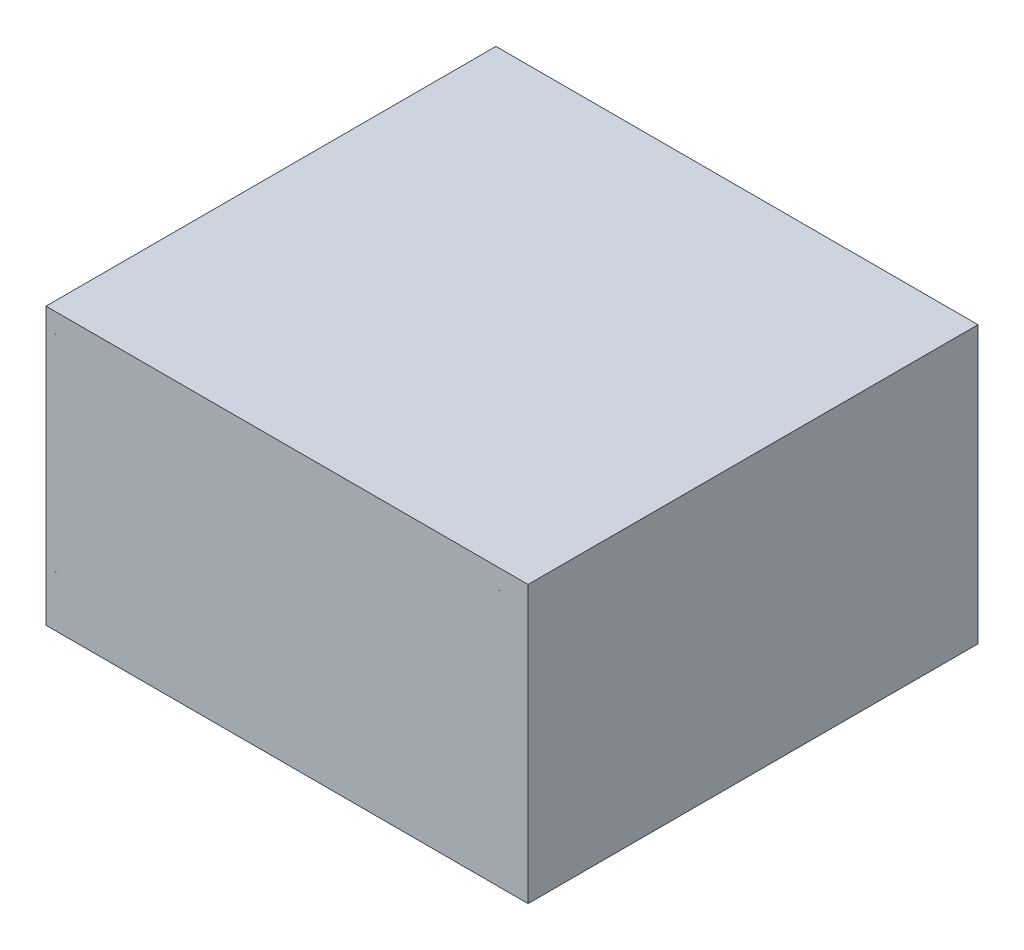
ISO-10303-21;
HEADER;
FILE_DESCRIPTION(('STEP AP214'),'2;1');
FILE_NAME('part.step','',(''),(''),'','','');
FILE_SCHEMA(('AUTOMOTIVE_DESIGN { 1 0 10303 214 1 1 1 1 }'));
ENDSEC;
DATA;
#1=APPLICATION_CONTEXT('core data for automotive mechanical design processes');
#2=APPLICATION_PROTOCOL_DEFINITION('international standard','automotive_design',2000,#1);
#3=PRODUCT_CONTEXT('',#1,'mechanical');
#4=PRODUCT('Part','Part','',(#3));
#5=PRODUCT_RELATED_PRODUCT_CATEGORY('part','',(#4));
#6=PRODUCT_DEFINITION_FORMATION('','',#4);
#7=PRODUCT_DEFINITION_CONTEXT('part definition',#1,'design');
#8=PRODUCT_DEFINITION('design','',#6,#7);
#9=PRODUCT_DEFINITION_SHAPE('','',#8);
#10=(LENGTH_UNIT() NAMED_UNIT(*) SI_UNIT(.MILLI.,.METRE.));
#11=(NAMED_UNIT(*) PLANE_ANGLE_UNIT() SI_UNIT($,.RADIAN.));
#12=(NAMED_UNIT(*) SI_UNIT($,.STERADIAN.) SOLID_ANGLE_UNIT());
#13=UNCERTAINTY_MEASURE_WITH_UNIT(LENGTH_MEASURE(1.E-05),#10,'distance_accuracy_value','');
#14=(GEOMETRIC_REPRESENTATION_CONTEXT(3) GLOBAL_UNCERTAINTY_ASSIGNED_CONTEXT((#13)) GLOBAL_UNIT_ASSIGNED_CONTEXT((#10,
#11,#12)) REPRESENTATION_CONTEXT('',''));
#15=CARTESIAN_POINT('',(0.,0.,0.));
#16=DIRECTION('',(0.,0.,1.));
#17=DIRECTION('',(1.,0.,0.));
#18=AXIS2_PLACEMENT_3D('',#15,#16,#17);
#19=CARTESIAN_POINT('',(0.,0.,-3556.));
#20=DIRECTION('',(0.,-1.,0.));
#21=DIRECTION('',(0.,0.,-1.));
#22=AXIS2_PLACEMENT_3D('',#19,#20,#21);
#23=PLANE('',#22);
#24=DIRECTION('',(1.,0.,0.));
#25=VECTOR('',#24,1.);
#26=CARTESIAN_POINT('',(0.,0.,0.));
#27=LINE('',#26,#25);
#28=CARTESIAN_POINT('',(0.,0.,0.));
#29=VERTEX_POINT('',#28);
#30=CARTESIAN_POINT('',(3810.,0.,0.));
#31=VERTEX_POINT('',#30);
#32=EDGE_CURVE('E101',#29,#31,#27,.T.);
#33=ORIENTED_EDGE('',*,*,#32,.F.);
#34=DIRECTION('',(0.,0.,1.));
#35=VECTOR('',#34,1.);
#36=CARTESIAN_POINT('',(0.,0.,-3556.));
#37=LINE('',#36,#35);
#38=CARTESIAN_POINT('',(0.,0.,-3556.));
#39=VERTEX_POINT('',#38);
#40=EDGE_CURVE('E11',#39,#29,#37,.T.);
#41=ORIENTED_EDGE('',*,*,#40,.F.);
#42=DIRECTION('',(1.,0.,0.));
#43=VECTOR('',#42,1.);
#44=CARTESIAN_POINT('',(0.,0.,-3556.));
#45=LINE('',#44,#43);
#46=CARTESIAN_POINT('',(3810.,0.,-3556.));
#47=VERTEX_POINT('',#46);
#48=EDGE_CURVE('E95',#39,#47,#45,.T.);
#49=ORIENTED_EDGE('',*,*,#48,.T.);
#50=DIRECTION('',(0.,0.,1.));
#51=VECTOR('',#50,1.);
#52=CARTESIAN_POINT('',(3810.,0.,-3556.));
#53=LINE('',#52,#51);
#54=EDGE_CURVE('E38',#47,#31,#53,.T.);
#55=ORIENTED_EDGE('',*,*,#54,.T.);
#56=EDGE_LOOP('',(#33,#41,#49,#55));
#57=FACE_BOUND('',#56,.T.);
#58=ADVANCED_FACE('F35',(#57),#23,.T.);
#59=CARTESIAN_POINT('',(0.,0.,-3556.));
#60=DIRECTION('',(1.,0.,0.));
#61=DIRECTION('',(0.,0.,-1.));
#62=AXIS2_PLACEMENT_3D('',#59,#60,#61);
#63=PLANE('',#62);
#64=DIRECTION('',(0.,1.,0.));
#65=VECTOR('',#64,1.);
#66=CARTESIAN_POINT('',(0.,0.,0.));
#67=LINE('',#66,#65);
#68=CARTESIAN_POINT('',(0.,2184.4,0.));
#69=VERTEX_POINT('',#68);
#70=EDGE_CURVE('E68',#29,#69,#67,.T.);
#71=ORIENTED_EDGE('',*,*,#70,.T.);
#72=DIRECTION('',(0.,0.,1.));
#73=VECTOR('',#72,1.);
#74=CARTESIAN_POINT('',(0.,2184.4,-3556.));
#75=LINE('',#74,#73);
#76=CARTESIAN_POINT('',(0.,2184.4,-3556.));
#77=VERTEX_POINT('',#76);
#78=EDGE_CURVE('E44',#77,#69,#75,.T.);
#79=ORIENTED_EDGE('',*,*,#78,.F.);
#80=DIRECTION('',(0.,1.,0.));
#81=VECTOR('',#80,1.);
#82=CARTESIAN_POINT('',(0.,0.,-3556.));
#83=LINE('',#82,#81);
#84=EDGE_CURVE('E85',#39,#77,#83,.T.);
#85=ORIENTED_EDGE('',*,*,#84,.F.);
#86=ORIENTED_EDGE('',*,*,#40,.T.);
#87=EDGE_LOOP('',(#71,#79,#85,#86));
#88=FACE_BOUND('',#87,.T.);
#89=ADVANCED_FACE('F112',(#88),#63,.F.);
#90=CARTESIAN_POINT('',(0.,2184.4,-3556.));
#91=DIRECTION('',(0.,-1.,0.));
#92=DIRECTION('',(0.,0.,-1.));
#93=AXIS2_PLACEMENT_3D('',#90,#91,#92);
#94=PLANE('',#93);
#95=DIRECTION('',(1.,0.,0.));
#96=VECTOR('',#95,1.);
#97=CARTESIAN_POINT('',(0.,2184.4,0.));
#98=LINE('',#97,#96);
#99=CARTESIAN_POINT('',(3810.,2184.4,0.));
#100=VERTEX_POINT('',#99);
#101=EDGE_CURVE('E92',#69,#100,#98,.T.);
#102=ORIENTED_EDGE('',*,*,#101,.T.);
#103=DIRECTION('',(0.,0.,1.));
#104=VECTOR('',#103,1.);
#105=CARTESIAN_POINT('',(3810.,2184.4,-3556.));
#106=LINE('',#105,#104);
#107=CARTESIAN_POINT('',(3810.,2184.4,-3556.));
#108=VERTEX_POINT('',#107);
#109=EDGE_CURVE('E89',#108,#100,#106,.T.);
#110=ORIENTED_EDGE('',*,*,#109,.F.);
#111=DIRECTION('',(1.,0.,0.));
#112=VECTOR('',#111,1.);
#113=CARTESIAN_POINT('',(0.,2184.4,-3556.));
#114=LINE('',#113,#112);
#115=EDGE_CURVE('E80',#77,#108,#114,.T.);
#116=ORIENTED_EDGE('',*,*,#115,.F.);
#117=ORIENTED_EDGE('',*,*,#78,.T.);
#118=EDGE_LOOP('',(#102,#110,#116,#117));
#119=FACE_BOUND('',#118,.T.);
#120=ADVANCED_FACE('F90',(#119),#94,.F.);
#121=CARTESIAN_POINT('',(3810.,0.,-3556.));
#122=DIRECTION('',(1.,0.,0.));
#123=DIRECTION('',(0.,0.,-1.));
#124=AXIS2_PLACEMENT_3D('',#121,#122,#123);
#125=PLANE('',#124);
#126=DIRECTION('',(0.,1.,0.));
#127=VECTOR('',#126,1.);
#128=CARTESIAN_POINT('',(3810.,0.,0.));
#129=LINE('',#128,#127);
#130=EDGE_CURVE('E104',#31,#100,#129,.T.);
#131=ORIENTED_EDGE('',*,*,#130,.F.);
#132=ORIENTED_EDGE('',*,*,#54,.F.);
#133=DIRECTION('',(0.,1.,0.));
#134=VECTOR('',#133,1.);
#135=CARTESIAN_POINT('',(3810.,0.,-3556.));
#136=LINE('',#135,#134);
#137=EDGE_CURVE('E84',#47,#108,#136,.T.);
#138=ORIENTED_EDGE('',*,*,#137,.T.);
#139=ORIENTED_EDGE('',*,*,#109,.T.);
#140=EDGE_LOOP('',(#131,#132,#138,#139));
#141=FACE_BOUND('',#140,.T.);
#142=ADVANCED_FACE('F94',(#141),#125,.T.);
#143=CARTESIAN_POINT('',(0.,0.,-3556.));
#144=DIRECTION('',(0.,0.,1.));
#145=DIRECTION('',(1.,0.,0.));
#146=AXIS2_PLACEMENT_3D('',#143,#144,#145);
#147=PLANE('',#146);
#148=ORIENTED_EDGE('',*,*,#48,.F.);
#149=ORIENTED_EDGE('',*,*,#84,.T.);
#150=ORIENTED_EDGE('',*,*,#115,.T.);
#151=ORIENTED_EDGE('',*,*,#137,.F.);
#152=EDGE_LOOP('',(#148,#149,#150,#151));
#153=FACE_BOUND('',#152,.T.);
#154=ADVANCED_FACE('F83',(#153),#147,.F.);
#155=CARTESIAN_POINT('',(0.,0.,0.));
#156=DIRECTION('',(0.,0.,1.));
#157=DIRECTION('',(1.,0.,0.));
#158=AXIS2_PLACEMENT_3D('',#155,#156,#157);
#159=PLANE('',#158);
#160=CARTESIAN_POINT('',(2971.8,152.4,0.));
#161=DIRECTION('',(0.,0.,1.));
#162=DIRECTION('',(1.,0.,0.));
#163=AXIS2_PLACEMENT_3D('',#160,#161,#162);
#164=CIRCLE('',#163,1.75259999999993);
#165=CARTESIAN_POINT('',(2973.5526,152.4,0.));
#166=VERTEX_POINT('',#165);
#167=EDGE_CURVE('E169',#166,#166,#164,.T.);
#168=ORIENTED_EDGE('',*,*,#167,.F.);
#169=EDGE_LOOP('',(#168));
#170=FACE_BOUND('',#169,.T.);
#171=CARTESIAN_POINT('',(76.2000000000002,406.4,0.));
#172=DIRECTION('',(0.,0.,1.));
#173=DIRECTION('',(1.,0.,0.));
#174=AXIS2_PLACEMENT_3D('',#171,#172,#173);
#175=CIRCLE('',#174,1.7526);
#176=CARTESIAN_POINT('',(77.9526000000002,406.4,0.));
#177=VERTEX_POINT('',#176);
#178=EDGE_CURVE('E168',#177,#177,#175,.T.);
#179=ORIENTED_EDGE('',*,*,#178,.F.);
#180=EDGE_LOOP('',(#179));
#181=FACE_BOUND('',#180,.T.);
#182=CARTESIAN_POINT('',(3581.4,2032.,0.));
#183=DIRECTION('',(0.,0.,1.));
#184=DIRECTION('',(1.,0.,0.));
#185=AXIS2_PLACEMENT_3D('',#182,#183,#184);
#186=CIRCLE('',#185,1.7525999999999);
#187=CARTESIAN_POINT('',(3583.1526,2032.,0.));
#188=VERTEX_POINT('',#187);
#189=EDGE_CURVE('E178',#188,#188,#186,.T.);
#190=ORIENTED_EDGE('',*,*,#189,.F.);
#191=EDGE_LOOP('',(#190));
#192=FACE_BOUND('',#191,.T.);
#193=CARTESIAN_POINT('',(76.2,2032.,0.));
#194=DIRECTION('',(0.,0.,1.));
#195=DIRECTION('',(1.,0.,0.));
#196=AXIS2_PLACEMENT_3D('',#193,#194,#195);
#197=CIRCLE('',#196,1.75259999999996);
#198=CARTESIAN_POINT('',(77.9526,2032.,0.));
#199=VERTEX_POINT('',#198);
#200=EDGE_CURVE('E183',#199,#199,#197,.T.);
#201=ORIENTED_EDGE('',*,*,#200,.F.);
#202=EDGE_LOOP('',(#201));
#203=FACE_BOUND('',#202,.T.);
#204=ORIENTED_EDGE('',*,*,#32,.T.);
#205=ORIENTED_EDGE('',*,*,#130,.T.);
#206=ORIENTED_EDGE('',*,*,#101,.F.);
#207=ORIENTED_EDGE('',*,*,#70,.F.);
#208=EDGE_LOOP('',(#204,#205,#206,#207));
#209=FACE_BOUND('',#208,.T.);
#210=ADVANCED_FACE('F110',(#170,#181,#192,#203,#209),#159,.T.);
#211=CARTESIAN_POINT('',(76.2,2032.,-127.));
#212=DIRECTION('',(0.,0.,1.));
#213=DIRECTION('',(1.,0.,0.));
#214=AXIS2_PLACEMENT_3D('',#211,#212,#213);
#215=CYLINDRICAL_SURFACE('',#214,1.75259999999996);
#216=CARTESIAN_POINT('',(76.2,2032.,-127.));
#217=DIRECTION('',(0.,0.,1.));
#218=DIRECTION('',(1.,0.,0.));
#219=AXIS2_PLACEMENT_3D('',#216,#217,#218);
#220=CIRCLE('',#219,1.75259999999996);
#221=CARTESIAN_POINT('',(77.9526,2032.,-127.));
#222=VERTEX_POINT('',#221);
#223=EDGE_CURVE('E105',#222,#222,#220,.T.);
#224=ORIENTED_EDGE('',*,*,#223,.F.);
#225=EDGE_LOOP('',(#224));
#226=FACE_BOUND('',#225,.T.);
#227=ORIENTED_EDGE('',*,*,#200,.T.);
#228=EDGE_LOOP('',(#227));
#229=FACE_BOUND('',#228,.T.);
#230=ADVANCED_FACE('F130',(#226,#229),#215,.F.);
#231=CARTESIAN_POINT('',(0.,0.,-127.));
#232=DIRECTION('',(0.,0.,1.));
#233=DIRECTION('',(1.,0.,0.));
#234=AXIS2_PLACEMENT_3D('',#231,#232,#233);
#235=PLANE('',#234);
#236=ORIENTED_EDGE('',*,*,#223,.T.);
#237=EDGE_LOOP('',(#236));
#238=FACE_BOUND('',#237,.T.);
#239=ADVANCED_FACE('F135',(#238),#235,.T.);
#240=CARTESIAN_POINT('',(3581.4,2032.,-127.));
#241=DIRECTION('',(0.,0.,1.));
#242=DIRECTION('',(1.,0.,0.));
#243=AXIS2_PLACEMENT_3D('',#240,#241,#242);
#244=CYLINDRICAL_SURFACE('',#243,1.7525999999999);
#245=CARTESIAN_POINT('',(3581.4,2032.,-127.));
#246=DIRECTION('',(0.,0.,1.));
#247=DIRECTION('',(1.,0.,0.));
#248=AXIS2_PLACEMENT_3D('',#245,#246,#247);
#249=CIRCLE('',#248,1.7525999999999);
#250=CARTESIAN_POINT('',(3583.1526,2032.,-127.));
#251=VERTEX_POINT('',#250);
#252=EDGE_CURVE('E180',#251,#251,#249,.T.);
#253=ORIENTED_EDGE('',*,*,#252,.F.);
#254=EDGE_LOOP('',(#253));
#255=FACE_BOUND('',#254,.T.);
#256=ORIENTED_EDGE('',*,*,#189,.T.);
#257=EDGE_LOOP('',(#256));
#258=FACE_BOUND('',#257,.T.);
#259=ADVANCED_FACE('F139',(#255,#258),#244,.F.);
#260=CARTESIAN_POINT('',(0.,0.,-127.));
#261=DIRECTION('',(0.,0.,1.));
#262=DIRECTION('',(1.,0.,0.));
#263=AXIS2_PLACEMENT_3D('',#260,#261,#262);
#264=PLANE('',#263);
#265=ORIENTED_EDGE('',*,*,#252,.T.);
#266=EDGE_LOOP('',(#265));
#267=FACE_BOUND('',#266,.T.);
#268=ADVANCED_FACE('F143',(#267),#264,.T.);
#269=CARTESIAN_POINT('',(76.2000000000002,406.4,-127.));
#270=DIRECTION('',(0.,0.,1.));
#271=DIRECTION('',(1.,0.,0.));
#272=AXIS2_PLACEMENT_3D('',#269,#270,#271);
#273=CYLINDRICAL_SURFACE('',#272,1.7526);
#274=CARTESIAN_POINT('',(76.2000000000002,406.4,-127.));
#275=DIRECTION('',(0.,0.,1.));
#276=DIRECTION('',(1.,0.,0.));
#277=AXIS2_PLACEMENT_3D('',#274,#275,#276);
#278=CIRCLE('',#277,1.7526);
#279=CARTESIAN_POINT('',(77.9526000000002,406.4,-127.));
#280=VERTEX_POINT('',#279);
#281=EDGE_CURVE('E172',#280,#280,#278,.T.);
#282=ORIENTED_EDGE('',*,*,#281,.F.);
#283=EDGE_LOOP('',(#282));
#284=FACE_BOUND('',#283,.T.);
#285=ORIENTED_EDGE('',*,*,#178,.T.);
#286=EDGE_LOOP('',(#285));
#287=FACE_BOUND('',#286,.T.);
#288=ADVANCED_FACE('F147',(#284,#287),#273,.F.);
#289=CARTESIAN_POINT('',(0.,0.,-127.));
#290=DIRECTION('',(0.,0.,1.));
#291=DIRECTION('',(1.,0.,0.));
#292=AXIS2_PLACEMENT_3D('',#289,#290,#291);
#293=PLANE('',#292);
#294=ORIENTED_EDGE('',*,*,#281,.T.);
#295=EDGE_LOOP('',(#294));
#296=FACE_BOUND('',#295,.T.);
#297=ADVANCED_FACE('F151',(#296),#293,.T.);
#298=CARTESIAN_POINT('',(2971.8,152.4,-127.));
#299=DIRECTION('',(0.,0.,1.));
#300=DIRECTION('',(1.,0.,0.));
#301=AXIS2_PLACEMENT_3D('',#298,#299,#300);
#302=CYLINDRICAL_SURFACE('',#301,1.75259999999993);
#303=CARTESIAN_POINT('',(2971.8,152.4,-127.));
#304=DIRECTION('',(0.,0.,1.));
#305=DIRECTION('',(1.,0.,0.));
#306=AXIS2_PLACEMENT_3D('',#303,#304,#305);
#307=CIRCLE('',#306,1.75259999999993);
#308=CARTESIAN_POINT('',(2973.5526,152.4,-127.));
#309=VERTEX_POINT('',#308);
#310=EDGE_CURVE('E167',#309,#309,#307,.T.);
#311=ORIENTED_EDGE('',*,*,#310,.F.);
#312=EDGE_LOOP('',(#311));
#313=FACE_BOUND('',#312,.T.);
#314=ORIENTED_EDGE('',*,*,#167,.T.);
#315=EDGE_LOOP('',(#314));
#316=FACE_BOUND('',#315,.T.);
#317=ADVANCED_FACE('F155',(#313,#316),#302,.F.);
#318=CARTESIAN_POINT('',(0.,0.,-127.));
#319=DIRECTION('',(0.,0.,1.));
#320=DIRECTION('',(1.,0.,0.));
#321=AXIS2_PLACEMENT_3D('',#318,#319,#320);
#322=PLANE('',#321);
#323=ORIENTED_EDGE('',*,*,#310,.T.);
#324=EDGE_LOOP('',(#323));
#325=FACE_BOUND('',#324,.T.);
#326=ADVANCED_FACE('F159',(#325),#322,.T.);
#327=CLOSED_SHELL('',(#58,#89,#120,#142,#154,#210,#230,#239,#259,#268,#288,#297,#317,#326));
#328=MANIFOLD_SOLID_BREP('B2',#327);
#329=ADVANCED_BREP_SHAPE_REPRESENTATION('',(#18,#328),#14);
#330=SHAPE_DEFINITION_REPRESENTATION(#9,#329);
ENDSEC;
END-ISO-10303-21;
